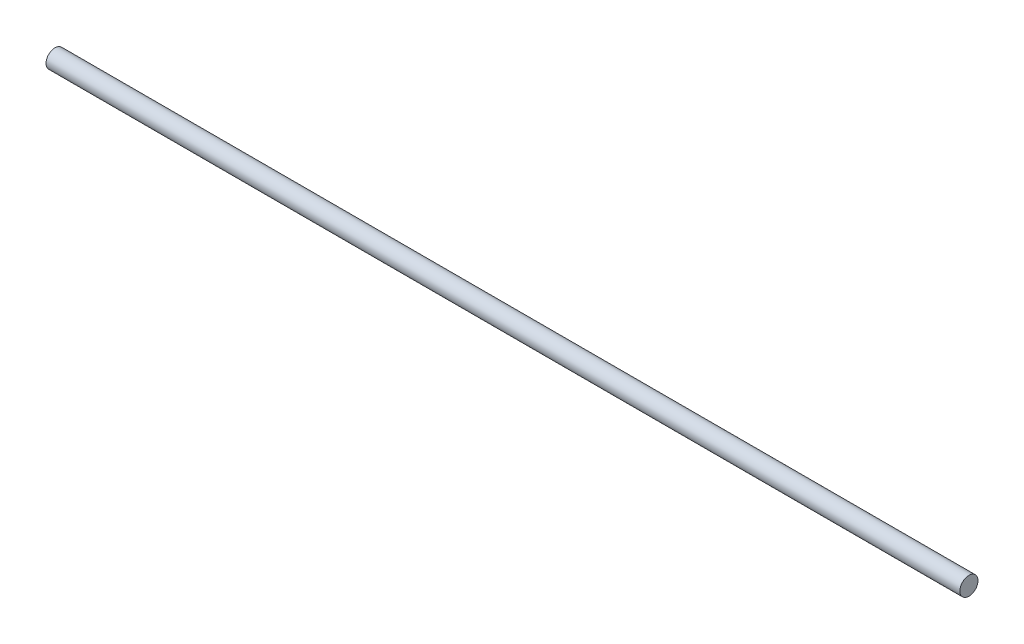
ISO-10303-21;
HEADER;
FILE_DESCRIPTION(('STEP AP214'),'2;1');
FILE_NAME('part.step','',(''),(''),'','','');
FILE_SCHEMA(('AUTOMOTIVE_DESIGN { 1 0 10303 214 1 1 1 1 }'));
ENDSEC;
DATA;
#1=APPLICATION_CONTEXT('core data for automotive mechanical design processes');
#2=APPLICATION_PROTOCOL_DEFINITION('international standard','automotive_design',2000,#1);
#3=PRODUCT_CONTEXT('',#1,'mechanical');
#4=PRODUCT('Part','Part','',(#3));
#5=PRODUCT_RELATED_PRODUCT_CATEGORY('part','',(#4));
#6=PRODUCT_DEFINITION_FORMATION('','',#4);
#7=PRODUCT_DEFINITION_CONTEXT('part definition',#1,'design');
#8=PRODUCT_DEFINITION('design','',#6,#7);
#9=PRODUCT_DEFINITION_SHAPE('','',#8);
#10=(LENGTH_UNIT() NAMED_UNIT(*) SI_UNIT(.MILLI.,.METRE.));
#11=(NAMED_UNIT(*) PLANE_ANGLE_UNIT() SI_UNIT($,.RADIAN.));
#12=(NAMED_UNIT(*) SI_UNIT($,.STERADIAN.) SOLID_ANGLE_UNIT());
#13=UNCERTAINTY_MEASURE_WITH_UNIT(LENGTH_MEASURE(1.E-05),#10,'distance_accuracy_value','');
#14=(GEOMETRIC_REPRESENTATION_CONTEXT(3) GLOBAL_UNCERTAINTY_ASSIGNED_CONTEXT((#13)) GLOBAL_UNIT_ASSIGNED_CONTEXT((#10,
#11,#12)) REPRESENTATION_CONTEXT('',''));
#15=CARTESIAN_POINT('',(0.,0.,0.));
#16=DIRECTION('',(0.,0.,1.));
#17=DIRECTION('',(1.,0.,0.));
#18=AXIS2_PLACEMENT_3D('',#15,#16,#17);
#19=CARTESIAN_POINT('',(0.,0.,0.));
#20=DIRECTION('',(1.,0.,0.));
#21=DIRECTION('',(0.,0.,-1.));
#22=AXIS2_PLACEMENT_3D('',#19,#20,#21);
#23=PLANE('',#22);
#24=CARTESIAN_POINT('',(0.,0.,0.));
#25=DIRECTION('',(1.,0.,0.));
#26=DIRECTION('',(0.,0.,-1.));
#27=AXIS2_PLACEMENT_3D('',#24,#25,#26);
#28=CIRCLE('',#27,7.9375);
#29=CARTESIAN_POINT('',(0.,0.,-7.9375));
#30=VERTEX_POINT('',#29);
#31=EDGE_CURVE('E40',#30,#30,#28,.T.);
#32=ORIENTED_EDGE('',*,*,#31,.F.);
#33=EDGE_LOOP('',(#32));
#34=FACE_BOUND('',#33,.T.);
#35=ADVANCED_FACE('F33',(#34),#23,.F.);
#36=CARTESIAN_POINT('',(832.450640302673,0.,0.));
#37=DIRECTION('',(-1.,0.,0.));
#38=DIRECTION('',(0.,0.,1.));
#39=AXIS2_PLACEMENT_3D('',#36,#37,#38);
#40=CYLINDRICAL_SURFACE('',#39,7.9375);
#41=CARTESIAN_POINT('',(800.,0.,0.));
#42=DIRECTION('',(-1.,0.,0.));
#43=DIRECTION('',(0.,-1.,0.));
#44=AXIS2_PLACEMENT_3D('',#41,#42,#43);
#45=CIRCLE('',#44,7.9375);
#46=CARTESIAN_POINT('',(800.,-7.9375,0.));
#47=VERTEX_POINT('',#46);
#48=EDGE_CURVE('E10',#47,#47,#45,.T.);
#49=ORIENTED_EDGE('',*,*,#48,.T.);
#50=EDGE_LOOP('',(#49));
#51=FACE_BOUND('',#50,.T.);
#52=ORIENTED_EDGE('',*,*,#31,.T.);
#53=EDGE_LOOP('',(#52));
#54=FACE_BOUND('',#53,.T.);
#55=ADVANCED_FACE('F35',(#51,#54),#40,.T.);
#56=CARTESIAN_POINT('',(800.,-49.8032796195295,-227.667241941103));
#57=DIRECTION('',(-1.,0.,0.));
#58=DIRECTION('',(0.,0.999999626621071,0.000864151444392863));
#59=AXIS2_PLACEMENT_3D('',#56,#57,#58);
#60=PLANE('',#59);
#61=ORIENTED_EDGE('',*,*,#48,.F.);
#62=EDGE_LOOP('',(#61));
#63=FACE_BOUND('',#62,.T.);
#64=ADVANCED_FACE('F51',(#63),#60,.F.);
#65=CLOSED_SHELL('',(#35,#55,#64));
#66=MANIFOLD_SOLID_BREP('B2',#65);
#67=ADVANCED_BREP_SHAPE_REPRESENTATION('',(#18,#66),#14);
#68=SHAPE_DEFINITION_REPRESENTATION(#9,#67);
ENDSEC;
END-ISO-10303-21;
